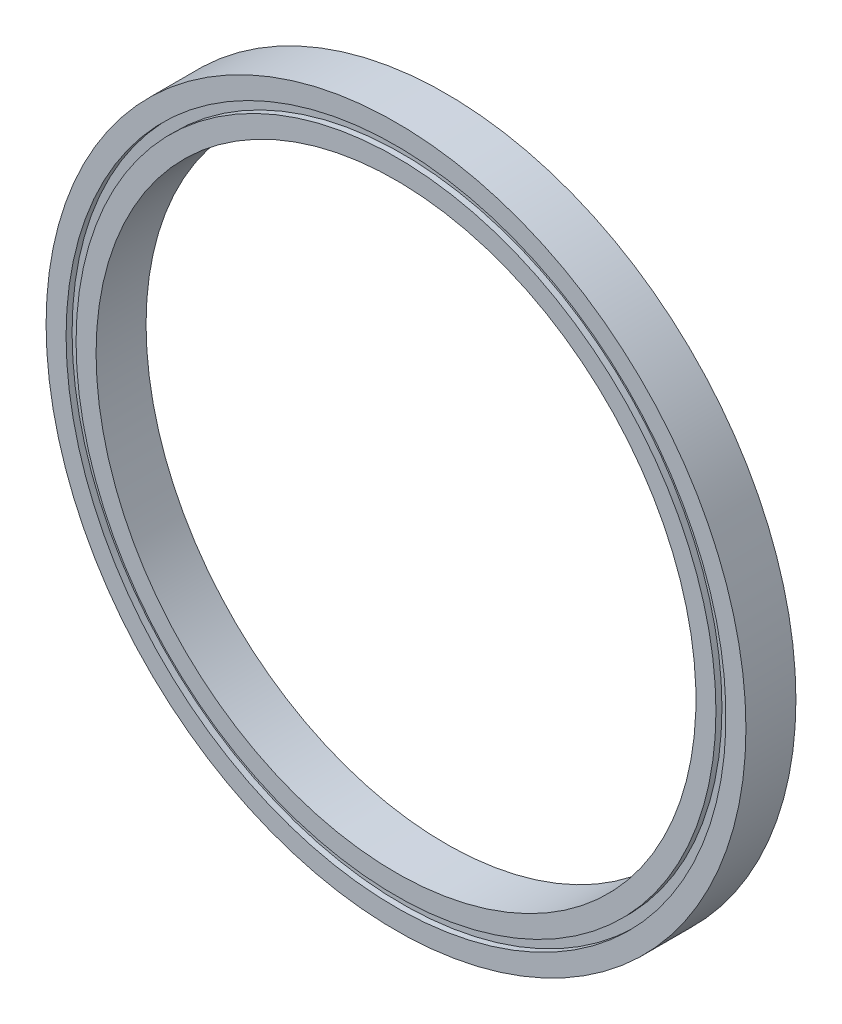
ISO-10303-21;
HEADER;
FILE_DESCRIPTION(('STEP AP214'),'2;1');
FILE_NAME('part.step','',(''),(''),'','','');
FILE_SCHEMA(('AUTOMOTIVE_DESIGN { 1 0 10303 214 1 1 1 1 }'));
ENDSEC;
DATA;
#1=APPLICATION_CONTEXT('core data for automotive mechanical design processes');
#2=APPLICATION_PROTOCOL_DEFINITION('international standard','automotive_design',2000,#1);
#3=PRODUCT_CONTEXT('',#1,'mechanical');
#4=PRODUCT('Part','Part','',(#3));
#5=PRODUCT_RELATED_PRODUCT_CATEGORY('part','',(#4));
#6=PRODUCT_DEFINITION_FORMATION('','',#4);
#7=PRODUCT_DEFINITION_CONTEXT('part definition',#1,'design');
#8=PRODUCT_DEFINITION('design','',#6,#7);
#9=PRODUCT_DEFINITION_SHAPE('','',#8);
#10=(LENGTH_UNIT() NAMED_UNIT(*) SI_UNIT(.MILLI.,.METRE.));
#11=(NAMED_UNIT(*) PLANE_ANGLE_UNIT() SI_UNIT($,.RADIAN.));
#12=(NAMED_UNIT(*) SI_UNIT($,.STERADIAN.) SOLID_ANGLE_UNIT());
#13=UNCERTAINTY_MEASURE_WITH_UNIT(LENGTH_MEASURE(1.E-05),#10,'distance_accuracy_value','');
#14=(GEOMETRIC_REPRESENTATION_CONTEXT(3) GLOBAL_UNCERTAINTY_ASSIGNED_CONTEXT((#13)) GLOBAL_UNIT_ASSIGNED_CONTEXT((#10,
#11,#12)) REPRESENTATION_CONTEXT('',''));
#15=CARTESIAN_POINT('',(0.,0.,0.));
#16=DIRECTION('',(0.,0.,1.));
#17=DIRECTION('',(1.,0.,0.));
#18=AXIS2_PLACEMENT_3D('',#15,#16,#17);
#19=CARTESIAN_POINT('',(0.,0.,85.3795000000001));
#20=DIRECTION('',(0.,0.,-1.));
#21=DIRECTION('',(-1.,0.,0.));
#22=AXIS2_PLACEMENT_3D('',#19,#20,#21);
#23=CYLINDRICAL_SURFACE('',#22,38.1);
#24=CARTESIAN_POINT('',(0.,0.,55.5625));
#25=DIRECTION('',(0.,0.,-1.));
#26=DIRECTION('',(-1.,0.,0.));
#27=AXIS2_PLACEMENT_3D('',#24,#25,#26);
#28=CIRCLE('',#27,38.1);
#29=CARTESIAN_POINT('',(-38.1,0.,55.5625));
#30=VERTEX_POINT('',#29);
#31=EDGE_CURVE('E19',#30,#30,#28,.T.);
#32=ORIENTED_EDGE('',*,*,#31,.T.);
#33=EDGE_LOOP('',(#32));
#34=FACE_BOUND('',#33,.T.);
#35=CARTESIAN_POINT('',(0.,0.,61.9125));
#36=DIRECTION('',(0.,0.,-1.));
#37=DIRECTION('',(-1.,0.,0.));
#38=AXIS2_PLACEMENT_3D('',#35,#36,#37);
#39=CIRCLE('',#38,38.1);
#40=CARTESIAN_POINT('',(-38.1,0.,61.9125));
#41=VERTEX_POINT('',#40);
#42=EDGE_CURVE('E65',#41,#41,#39,.T.);
#43=ORIENTED_EDGE('',*,*,#42,.F.);
#44=EDGE_LOOP('',(#43));
#45=FACE_BOUND('',#44,.T.);
#46=ADVANCED_FACE('F16',(#34,#45),#23,.F.);
#47=CARTESIAN_POINT('',(39.37,0.,55.5625));
#48=DIRECTION('',(0.,0.,1.));
#49=DIRECTION('',(1.,0.,0.));
#50=AXIS2_PLACEMENT_3D('',#47,#48,#49);
#51=PLANE('',#50);
#52=ORIENTED_EDGE('',*,*,#31,.F.);
#53=EDGE_LOOP('',(#52));
#54=FACE_BOUND('',#53,.T.);
#55=CARTESIAN_POINT('',(0.,0.,55.5625));
#56=DIRECTION('',(0.,0.,-1.));
#57=DIRECTION('',(-1.,0.,0.));
#58=AXIS2_PLACEMENT_3D('',#55,#56,#57);
#59=CIRCLE('',#58,40.64);
#60=CARTESIAN_POINT('',(-40.64,0.,55.5625));
#61=VERTEX_POINT('',#60);
#62=EDGE_CURVE('E62',#61,#61,#59,.F.);
#63=ORIENTED_EDGE('',*,*,#62,.F.);
#64=EDGE_LOOP('',(#63));
#65=FACE_BOUND('',#64,.T.);
#66=ADVANCED_FACE('F75',(#54,#65),#51,.F.);
#67=CARTESIAN_POINT('',(40.16375,0.,61.9125));
#68=DIRECTION('',(0.,0.,1.));
#69=DIRECTION('',(1.,0.,0.));
#70=AXIS2_PLACEMENT_3D('',#67,#68,#69);
#71=PLANE('',#70);
#72=ORIENTED_EDGE('',*,*,#42,.T.);
#73=EDGE_LOOP('',(#72));
#74=FACE_BOUND('',#73,.T.);
#75=CARTESIAN_POINT('',(0.,0.,61.9125));
#76=DIRECTION('',(0.,0.,-1.));
#77=DIRECTION('',(-1.,0.,0.));
#78=AXIS2_PLACEMENT_3D('',#75,#76,#77);
#79=CIRCLE('',#78,40.64);
#80=CARTESIAN_POINT('',(-40.64,0.,61.9125));
#81=VERTEX_POINT('',#80);
#82=EDGE_CURVE('E58',#81,#81,#79,.T.);
#83=ORIENTED_EDGE('',*,*,#82,.F.);
#84=EDGE_LOOP('',(#83));
#85=FACE_BOUND('',#84,.T.);
#86=ADVANCED_FACE('F78',(#74,#85),#71,.T.);
#87=CARTESIAN_POINT('',(0.,0.,85.3795000000001));
#88=DIRECTION('',(0.,0.,-1.));
#89=DIRECTION('',(-1.,0.,0.));
#90=AXIS2_PLACEMENT_3D('',#87,#88,#89);
#91=CYLINDRICAL_SURFACE('',#90,40.64);
#92=CARTESIAN_POINT('',(0.,0.,56.3245));
#93=DIRECTION('',(0.,0.,-1.));
#94=DIRECTION('',(-1.,0.,0.));
#95=AXIS2_PLACEMENT_3D('',#92,#93,#94);
#96=CIRCLE('',#95,40.64);
#97=CARTESIAN_POINT('',(-40.64,0.,56.3245));
#98=VERTEX_POINT('',#97);
#99=EDGE_CURVE('E54',#98,#98,#96,.T.);
#100=ORIENTED_EDGE('',*,*,#99,.T.);
#101=EDGE_LOOP('',(#100));
#102=FACE_BOUND('',#101,.T.);
#103=ORIENTED_EDGE('',*,*,#62,.T.);
#104=EDGE_LOOP('',(#103));
#105=FACE_BOUND('',#104,.T.);
#106=ADVANCED_FACE('F81',(#102,#105),#91,.T.);
#107=CARTESIAN_POINT('',(0.,0.,85.3795000000001));
#108=DIRECTION('',(0.,0.,-1.));
#109=DIRECTION('',(-1.,0.,0.));
#110=AXIS2_PLACEMENT_3D('',#107,#108,#109);
#111=CYLINDRICAL_SURFACE('',#110,40.64);
#112=ORIENTED_EDGE('',*,*,#82,.T.);
#113=EDGE_LOOP('',(#112));
#114=FACE_BOUND('',#113,.T.);
#115=CARTESIAN_POINT('',(0.,0.,61.1505));
#116=DIRECTION('',(0.,0.,-1.));
#117=DIRECTION('',(-1.,0.,0.));
#118=AXIS2_PLACEMENT_3D('',#115,#116,#117);
#119=CIRCLE('',#118,40.64);
#120=CARTESIAN_POINT('',(-40.64,0.,61.1505));
#121=VERTEX_POINT('',#120);
#122=EDGE_CURVE('E48',#121,#121,#119,.T.);
#123=ORIENTED_EDGE('',*,*,#122,.F.);
#124=EDGE_LOOP('',(#123));
#125=FACE_BOUND('',#124,.T.);
#126=ADVANCED_FACE('F83',(#114,#125),#111,.T.);
#127=CARTESIAN_POINT('',(41.275,0.,56.3245));
#128=DIRECTION('',(0.,0.,1.));
#129=DIRECTION('',(1.,0.,0.));
#130=AXIS2_PLACEMENT_3D('',#127,#128,#129);
#131=PLANE('',#130);
#132=ORIENTED_EDGE('',*,*,#99,.F.);
#133=EDGE_LOOP('',(#132));
#134=FACE_BOUND('',#133,.T.);
#135=CARTESIAN_POINT('',(0.,0.,56.3245));
#136=DIRECTION('',(0.,0.,-1.));
#137=DIRECTION('',(-1.,0.,0.));
#138=AXIS2_PLACEMENT_3D('',#135,#136,#137);
#139=CIRCLE('',#138,41.91);
#140=CARTESIAN_POINT('',(-41.91,0.,56.3245));
#141=VERTEX_POINT('',#140);
#142=EDGE_CURVE('E45',#141,#141,#139,.T.);
#143=ORIENTED_EDGE('',*,*,#142,.T.);
#144=EDGE_LOOP('',(#143));
#145=FACE_BOUND('',#144,.T.);
#146=ADVANCED_FACE('F91',(#134,#145),#131,.F.);
#147=CARTESIAN_POINT('',(41.275,0.,61.1505));
#148=DIRECTION('',(0.,0.,1.));
#149=DIRECTION('',(1.,0.,0.));
#150=AXIS2_PLACEMENT_3D('',#147,#148,#149);
#151=PLANE('',#150);
#152=ORIENTED_EDGE('',*,*,#122,.T.);
#153=EDGE_LOOP('',(#152));
#154=FACE_BOUND('',#153,.T.);
#155=CARTESIAN_POINT('',(0.,0.,61.1505));
#156=DIRECTION('',(0.,0.,-1.));
#157=DIRECTION('',(-1.,0.,0.));
#158=AXIS2_PLACEMENT_3D('',#155,#156,#157);
#159=CIRCLE('',#158,41.91);
#160=CARTESIAN_POINT('',(-41.91,0.,61.1505));
#161=VERTEX_POINT('',#160);
#162=EDGE_CURVE('E41',#161,#161,#159,.F.);
#163=ORIENTED_EDGE('',*,*,#162,.T.);
#164=EDGE_LOOP('',(#163));
#165=FACE_BOUND('',#164,.T.);
#166=ADVANCED_FACE('F117',(#154,#165),#151,.T.);
#167=CARTESIAN_POINT('',(0.,0.,85.3795000000001));
#168=DIRECTION('',(0.,0.,-1.));
#169=DIRECTION('',(-1.,0.,0.));
#170=AXIS2_PLACEMENT_3D('',#167,#168,#169);
#171=CYLINDRICAL_SURFACE('',#170,41.91);
#172=CARTESIAN_POINT('',(0.,0.,55.5625));
#173=DIRECTION('',(0.,0.,-1.));
#174=DIRECTION('',(-1.,0.,0.));
#175=AXIS2_PLACEMENT_3D('',#172,#173,#174);
#176=CIRCLE('',#175,41.91);
#177=CARTESIAN_POINT('',(-41.91,0.,55.5625));
#178=VERTEX_POINT('',#177);
#179=EDGE_CURVE('E37',#178,#178,#176,.T.);
#180=ORIENTED_EDGE('',*,*,#179,.T.);
#181=EDGE_LOOP('',(#180));
#182=FACE_BOUND('',#181,.T.);
#183=ORIENTED_EDGE('',*,*,#142,.F.);
#184=EDGE_LOOP('',(#183));
#185=FACE_BOUND('',#184,.T.);
#186=ADVANCED_FACE('F113',(#182,#185),#171,.F.);
#187=CARTESIAN_POINT('',(0.,0.,85.3795000000001));
#188=DIRECTION('',(0.,0.,-1.));
#189=DIRECTION('',(-1.,0.,0.));
#190=AXIS2_PLACEMENT_3D('',#187,#188,#189);
#191=CYLINDRICAL_SURFACE('',#190,41.91);
#192=ORIENTED_EDGE('',*,*,#162,.F.);
#193=EDGE_LOOP('',(#192));
#194=FACE_BOUND('',#193,.T.);
#195=CARTESIAN_POINT('',(0.,0.,61.9125));
#196=DIRECTION('',(0.,0.,-1.));
#197=DIRECTION('',(-1.,0.,0.));
#198=AXIS2_PLACEMENT_3D('',#195,#196,#197);
#199=CIRCLE('',#198,41.91);
#200=CARTESIAN_POINT('',(-41.91,0.,61.9125));
#201=VERTEX_POINT('',#200);
#202=EDGE_CURVE('E29',#201,#201,#199,.T.);
#203=ORIENTED_EDGE('',*,*,#202,.F.);
#204=EDGE_LOOP('',(#203));
#205=FACE_BOUND('',#204,.T.);
#206=ADVANCED_FACE('F109',(#194,#205),#191,.F.);
#207=CARTESIAN_POINT('',(43.18,0.,55.5625));
#208=DIRECTION('',(0.,0.,1.));
#209=DIRECTION('',(1.,0.,0.));
#210=AXIS2_PLACEMENT_3D('',#207,#208,#209);
#211=PLANE('',#210);
#212=ORIENTED_EDGE('',*,*,#179,.F.);
#213=EDGE_LOOP('',(#212));
#214=FACE_BOUND('',#213,.T.);
#215=CARTESIAN_POINT('',(0.,0.,55.5625));
#216=DIRECTION('',(0.,0.,-1.));
#217=DIRECTION('',(-1.,0.,0.));
#218=AXIS2_PLACEMENT_3D('',#215,#216,#217);
#219=CIRCLE('',#218,44.45);
#220=CARTESIAN_POINT('',(-44.45,0.,55.5625));
#221=VERTEX_POINT('',#220);
#222=EDGE_CURVE('E24',#221,#221,#219,.F.);
#223=ORIENTED_EDGE('',*,*,#222,.F.);
#224=EDGE_LOOP('',(#223));
#225=FACE_BOUND('',#224,.T.);
#226=ADVANCED_FACE('F102',(#214,#225),#211,.F.);
#227=CARTESIAN_POINT('',(43.18,0.,61.9125));
#228=DIRECTION('',(0.,0.,1.));
#229=DIRECTION('',(1.,0.,0.));
#230=AXIS2_PLACEMENT_3D('',#227,#228,#229);
#231=PLANE('',#230);
#232=ORIENTED_EDGE('',*,*,#202,.T.);
#233=EDGE_LOOP('',(#232));
#234=FACE_BOUND('',#233,.T.);
#235=CARTESIAN_POINT('',(0.,0.,61.9125));
#236=DIRECTION('',(0.,0.,-1.));
#237=DIRECTION('',(-1.,0.,0.));
#238=AXIS2_PLACEMENT_3D('',#235,#236,#237);
#239=CIRCLE('',#238,44.45);
#240=CARTESIAN_POINT('',(-44.45,0.,61.9125));
#241=VERTEX_POINT('',#240);
#242=EDGE_CURVE('E10',#241,#241,#239,.T.);
#243=ORIENTED_EDGE('',*,*,#242,.F.);
#244=EDGE_LOOP('',(#243));
#245=FACE_BOUND('',#244,.T.);
#246=ADVANCED_FACE('F97',(#234,#245),#231,.T.);
#247=CARTESIAN_POINT('',(0.,0.,85.3795000000001));
#248=DIRECTION('',(0.,0.,-1.));
#249=DIRECTION('',(-1.,0.,0.));
#250=AXIS2_PLACEMENT_3D('',#247,#248,#249);
#251=CYLINDRICAL_SURFACE('',#250,44.45);
#252=ORIENTED_EDGE('',*,*,#242,.T.);
#253=EDGE_LOOP('',(#252));
#254=FACE_BOUND('',#253,.T.);
#255=ORIENTED_EDGE('',*,*,#222,.T.);
#256=EDGE_LOOP('',(#255));
#257=FACE_BOUND('',#256,.T.);
#258=ADVANCED_FACE('F95',(#254,#257),#251,.T.);
#259=CLOSED_SHELL('',(#46,#66,#86,#106,#126,#146,#166,#186,#206,#226,#246,#258));
#260=MANIFOLD_SOLID_BREP('B1',#259);
#261=ADVANCED_BREP_SHAPE_REPRESENTATION('',(#18,#260),#14);
#262=SHAPE_DEFINITION_REPRESENTATION(#9,#261);
ENDSEC;
END-ISO-10303-21;
